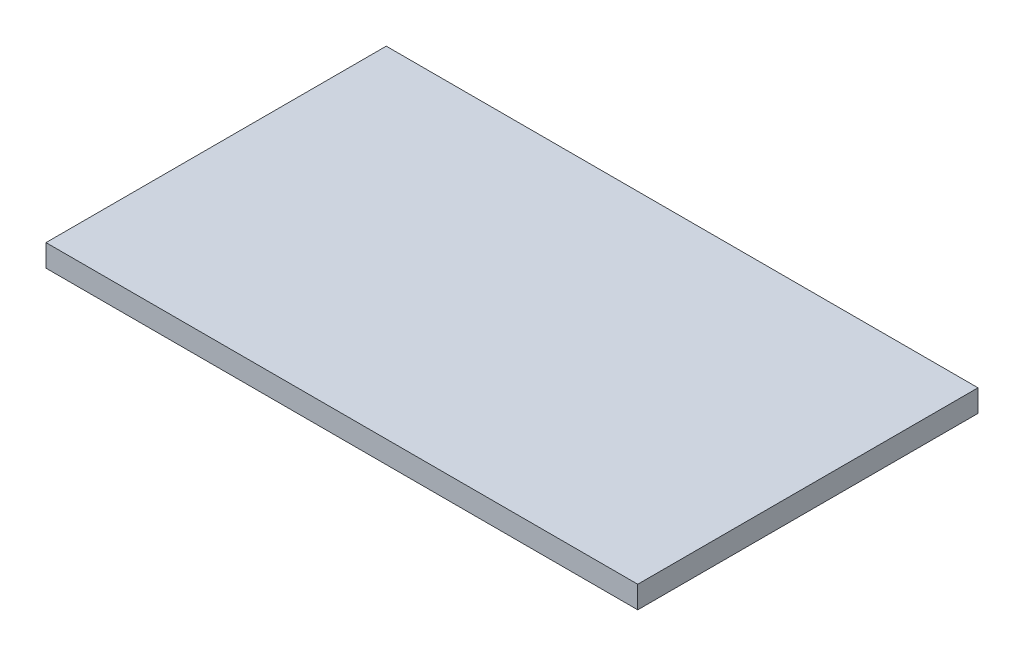
ISO-10303-21;
HEADER;
FILE_DESCRIPTION(('STEP AP214'),'2;1');
FILE_NAME('part.step','',(''),(''),'','','');
FILE_SCHEMA(('AUTOMOTIVE_DESIGN { 1 0 10303 214 1 1 1 1 }'));
ENDSEC;
DATA;
#1=APPLICATION_CONTEXT('core data for automotive mechanical design processes');
#2=APPLICATION_PROTOCOL_DEFINITION('international standard','automotive_design',2000,#1);
#3=PRODUCT_CONTEXT('',#1,'mechanical');
#4=PRODUCT('Part','Part','',(#3));
#5=PRODUCT_RELATED_PRODUCT_CATEGORY('part','',(#4));
#6=PRODUCT_DEFINITION_FORMATION('','',#4);
#7=PRODUCT_DEFINITION_CONTEXT('part definition',#1,'design');
#8=PRODUCT_DEFINITION('design','',#6,#7);
#9=PRODUCT_DEFINITION_SHAPE('','',#8);
#10=(LENGTH_UNIT() NAMED_UNIT(*) SI_UNIT(.MILLI.,.METRE.));
#11=(NAMED_UNIT(*) PLANE_ANGLE_UNIT() SI_UNIT($,.RADIAN.));
#12=(NAMED_UNIT(*) SI_UNIT($,.STERADIAN.) SOLID_ANGLE_UNIT());
#13=UNCERTAINTY_MEASURE_WITH_UNIT(LENGTH_MEASURE(1.E-05),#10,'distance_accuracy_value','');
#14=(GEOMETRIC_REPRESENTATION_CONTEXT(3) GLOBAL_UNCERTAINTY_ASSIGNED_CONTEXT((#13)) GLOBAL_UNIT_ASSIGNED_CONTEXT((#10,
#11,#12)) REPRESENTATION_CONTEXT('',''));
#15=CARTESIAN_POINT('',(0.,0.,0.));
#16=DIRECTION('',(0.,0.,1.));
#17=DIRECTION('',(1.,0.,0.));
#18=AXIS2_PLACEMENT_3D('',#15,#16,#17);
#19=CARTESIAN_POINT('',(0.,19.05,0.));
#20=DIRECTION('',(1.,0.,0.));
#21=DIRECTION('',(0.,0.,-1.));
#22=AXIS2_PLACEMENT_3D('',#19,#20,#21);
#23=PLANE('',#22);
#24=DIRECTION('',(0.,0.,1.));
#25=VECTOR('',#24,1.);
#26=CARTESIAN_POINT('',(0.,0.,0.));
#27=LINE('',#26,#25);
#28=CARTESIAN_POINT('',(0.,0.,-292.1));
#29=VERTEX_POINT('',#28);
#30=CARTESIAN_POINT('',(0.,0.,0.));
#31=VERTEX_POINT('',#30);
#32=EDGE_CURVE('E96',#29,#31,#27,.T.);
#33=ORIENTED_EDGE('',*,*,#32,.T.);
#34=DIRECTION('',(0.,-1.,0.));
#35=VECTOR('',#34,1.);
#36=CARTESIAN_POINT('',(0.,19.05,0.));
#37=LINE('',#36,#35);
#38=CARTESIAN_POINT('',(0.,19.05,0.));
#39=VERTEX_POINT('',#38);
#40=EDGE_CURVE('E11',#39,#31,#37,.T.);
#41=ORIENTED_EDGE('',*,*,#40,.F.);
#42=DIRECTION('',(0.,0.,1.));
#43=VECTOR('',#42,1.);
#44=CARTESIAN_POINT('',(0.,19.05,0.));
#45=LINE('',#44,#43);
#46=CARTESIAN_POINT('',(0.,19.05,-292.1));
#47=VERTEX_POINT('',#46);
#48=EDGE_CURVE('E84',#47,#39,#45,.T.);
#49=ORIENTED_EDGE('',*,*,#48,.F.);
#50=DIRECTION('',(0.,-1.,0.));
#51=VECTOR('',#50,1.);
#52=CARTESIAN_POINT('',(0.,19.05,-292.1));
#53=LINE('',#52,#51);
#54=EDGE_CURVE('E92',#47,#29,#53,.T.);
#55=ORIENTED_EDGE('',*,*,#54,.T.);
#56=EDGE_LOOP('',(#33,#41,#49,#55));
#57=FACE_BOUND('',#56,.T.);
#58=ADVANCED_FACE('F33',(#57),#23,.F.);
#59=CARTESIAN_POINT('',(0.,19.05,0.));
#60=DIRECTION('',(0.,0.,-1.));
#61=DIRECTION('',(-1.,0.,0.));
#62=AXIS2_PLACEMENT_3D('',#59,#60,#61);
#63=PLANE('',#62);
#64=DIRECTION('',(1.,0.,0.));
#65=VECTOR('',#64,1.);
#66=CARTESIAN_POINT('',(0.,0.,0.));
#67=LINE('',#66,#65);
#68=CARTESIAN_POINT('',(508.,0.,0.));
#69=VERTEX_POINT('',#68);
#70=EDGE_CURVE('E88',#31,#69,#67,.T.);
#71=ORIENTED_EDGE('',*,*,#70,.T.);
#72=DIRECTION('',(0.,-1.,0.));
#73=VECTOR('',#72,1.);
#74=CARTESIAN_POINT('',(508.,19.05,0.));
#75=LINE('',#74,#73);
#76=CARTESIAN_POINT('',(508.,19.05,0.));
#77=VERTEX_POINT('',#76);
#78=EDGE_CURVE('E41',#77,#69,#75,.T.);
#79=ORIENTED_EDGE('',*,*,#78,.F.);
#80=DIRECTION('',(1.,0.,0.));
#81=VECTOR('',#80,1.);
#82=CARTESIAN_POINT('',(0.,19.05,0.));
#83=LINE('',#82,#81);
#84=EDGE_CURVE('E79',#39,#77,#83,.T.);
#85=ORIENTED_EDGE('',*,*,#84,.F.);
#86=ORIENTED_EDGE('',*,*,#40,.T.);
#87=EDGE_LOOP('',(#71,#79,#85,#86));
#88=FACE_BOUND('',#87,.T.);
#89=ADVANCED_FACE('F87',(#88),#63,.F.);
#90=CARTESIAN_POINT('',(508.,19.05,0.));
#91=DIRECTION('',(-1.,0.,0.));
#92=DIRECTION('',(0.,0.,1.));
#93=AXIS2_PLACEMENT_3D('',#90,#91,#92);
#94=PLANE('',#93);
#95=DIRECTION('',(0.,0.,-1.));
#96=VECTOR('',#95,1.);
#97=CARTESIAN_POINT('',(508.,0.,0.));
#98=LINE('',#97,#96);
#99=CARTESIAN_POINT('',(508.,0.,-292.1));
#100=VERTEX_POINT('',#99);
#101=EDGE_CURVE('E66',#69,#100,#98,.T.);
#102=ORIENTED_EDGE('',*,*,#101,.T.);
#103=DIRECTION('',(0.,-1.,0.));
#104=VECTOR('',#103,1.);
#105=CARTESIAN_POINT('',(508.,19.05,-292.1));
#106=LINE('',#105,#104);
#107=CARTESIAN_POINT('',(508.,19.05,-292.1));
#108=VERTEX_POINT('',#107);
#109=EDGE_CURVE('E89',#108,#100,#106,.T.);
#110=ORIENTED_EDGE('',*,*,#109,.F.);
#111=DIRECTION('',(0.,0.,-1.));
#112=VECTOR('',#111,1.);
#113=CARTESIAN_POINT('',(508.,19.05,0.));
#114=LINE('',#113,#112);
#115=EDGE_CURVE('E82',#77,#108,#114,.T.);
#116=ORIENTED_EDGE('',*,*,#115,.F.);
#117=ORIENTED_EDGE('',*,*,#78,.T.);
#118=EDGE_LOOP('',(#102,#110,#116,#117));
#119=FACE_BOUND('',#118,.T.);
#120=ADVANCED_FACE('F90',(#119),#94,.F.);
#121=CARTESIAN_POINT('',(0.,19.05,-292.1));
#122=DIRECTION('',(0.,0.,1.));
#123=DIRECTION('',(1.,0.,0.));
#124=AXIS2_PLACEMENT_3D('',#121,#122,#123);
#125=PLANE('',#124);
#126=DIRECTION('',(-1.,0.,0.));
#127=VECTOR('',#126,1.);
#128=CARTESIAN_POINT('',(0.,0.,-292.1));
#129=LINE('',#128,#127);
#130=EDGE_CURVE('E72',#100,#29,#129,.T.);
#131=ORIENTED_EDGE('',*,*,#130,.T.);
#132=ORIENTED_EDGE('',*,*,#54,.F.);
#133=DIRECTION('',(-1.,0.,0.));
#134=VECTOR('',#133,1.);
#135=CARTESIAN_POINT('',(0.,19.05,-292.1));
#136=LINE('',#135,#134);
#137=EDGE_CURVE('E49',#108,#47,#136,.T.);
#138=ORIENTED_EDGE('',*,*,#137,.F.);
#139=ORIENTED_EDGE('',*,*,#109,.T.);
#140=EDGE_LOOP('',(#131,#132,#138,#139));
#141=FACE_BOUND('',#140,.T.);
#142=ADVANCED_FACE('F103',(#141),#125,.F.);
#143=CARTESIAN_POINT('',(0.,19.05,0.));
#144=DIRECTION('',(0.,-1.,0.));
#145=DIRECTION('',(0.,0.,-1.));
#146=AXIS2_PLACEMENT_3D('',#143,#144,#145);
#147=PLANE('',#146);
#148=ORIENTED_EDGE('',*,*,#48,.T.);
#149=ORIENTED_EDGE('',*,*,#84,.T.);
#150=ORIENTED_EDGE('',*,*,#115,.T.);
#151=ORIENTED_EDGE('',*,*,#137,.T.);
#152=EDGE_LOOP('',(#148,#149,#150,#151));
#153=FACE_BOUND('',#152,.T.);
#154=ADVANCED_FACE('F80',(#153),#147,.F.);
#155=CARTESIAN_POINT('',(0.,0.,0.));
#156=DIRECTION('',(0.,-1.,0.));
#157=DIRECTION('',(0.,0.,-1.));
#158=AXIS2_PLACEMENT_3D('',#155,#156,#157);
#159=PLANE('',#158);
#160=ORIENTED_EDGE('',*,*,#32,.F.);
#161=ORIENTED_EDGE('',*,*,#130,.F.);
#162=ORIENTED_EDGE('',*,*,#101,.F.);
#163=ORIENTED_EDGE('',*,*,#70,.F.);
#164=EDGE_LOOP('',(#160,#161,#162,#163));
#165=FACE_BOUND('',#164,.T.);
#166=ADVANCED_FACE('F106',(#165),#159,.T.);
#167=CLOSED_SHELL('',(#58,#89,#120,#142,#154,#166));
#168=MANIFOLD_SOLID_BREP('B2',#167);
#169=ADVANCED_BREP_SHAPE_REPRESENTATION('',(#18,#168),#14);
#170=SHAPE_DEFINITION_REPRESENTATION(#9,#169);
ENDSEC;
END-ISO-10303-21;
